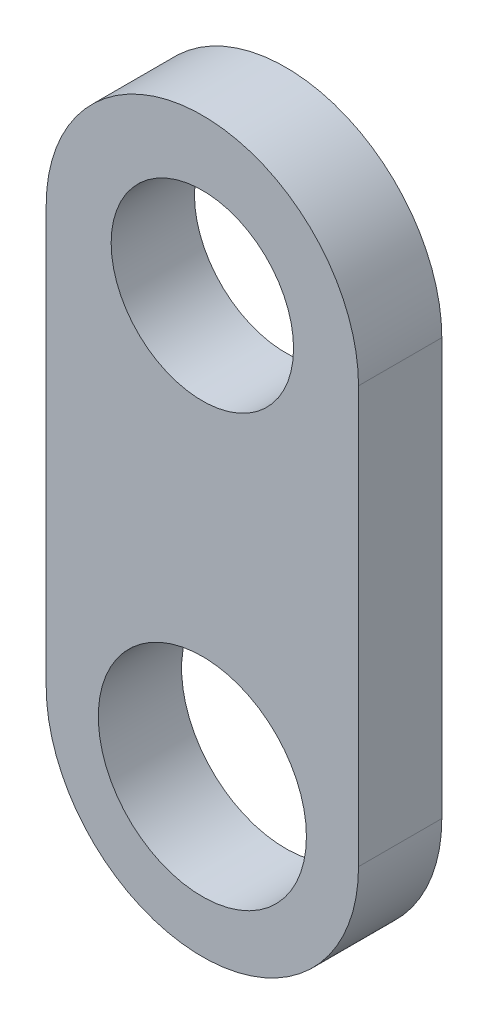
ISO-10303-21;
HEADER;
FILE_DESCRIPTION(('STEP AP214'),'2;1');
FILE_NAME('part.step','',(''),(''),'','','');
FILE_SCHEMA(('AUTOMOTIVE_DESIGN { 1 0 10303 214 1 1 1 1 }'));
ENDSEC;
DATA;
#1=APPLICATION_CONTEXT('core data for automotive mechanical design processes');
#2=APPLICATION_PROTOCOL_DEFINITION('international standard','automotive_design',2000,#1);
#3=PRODUCT_CONTEXT('',#1,'mechanical');
#4=PRODUCT('Part','Part','',(#3));
#5=PRODUCT_RELATED_PRODUCT_CATEGORY('part','',(#4));
#6=PRODUCT_DEFINITION_FORMATION('','',#4);
#7=PRODUCT_DEFINITION_CONTEXT('part definition',#1,'design');
#8=PRODUCT_DEFINITION('design','',#6,#7);
#9=PRODUCT_DEFINITION_SHAPE('','',#8);
#10=(LENGTH_UNIT() NAMED_UNIT(*) SI_UNIT(.MILLI.,.METRE.));
#11=(NAMED_UNIT(*) PLANE_ANGLE_UNIT() SI_UNIT($,.RADIAN.));
#12=(NAMED_UNIT(*) SI_UNIT($,.STERADIAN.) SOLID_ANGLE_UNIT());
#13=UNCERTAINTY_MEASURE_WITH_UNIT(LENGTH_MEASURE(1.E-05),#10,'distance_accuracy_value','');
#14=(GEOMETRIC_REPRESENTATION_CONTEXT(3) GLOBAL_UNCERTAINTY_ASSIGNED_CONTEXT((#13)) GLOBAL_UNIT_ASSIGNED_CONTEXT((#10,
#11,#12)) REPRESENTATION_CONTEXT('',''));
#15=CARTESIAN_POINT('',(0.,0.,0.));
#16=DIRECTION('',(0.,0.,1.));
#17=DIRECTION('',(1.,0.,0.));
#18=AXIS2_PLACEMENT_3D('',#15,#16,#17);
#19=CARTESIAN_POINT('',(0.,0.,5.08));
#20=DIRECTION('',(0.,0.,1.));
#21=DIRECTION('',(1.,0.,0.));
#22=AXIS2_PLACEMENT_3D('',#19,#20,#21);
#23=PLANE('',#22);
#24=CARTESIAN_POINT('',(0.,50.8,5.08));
#25=DIRECTION('',(0.,0.,1.));
#26=DIRECTION('',(1.,0.,0.));
#27=AXIS2_PLACEMENT_3D('',#24,#25,#26);
#28=CIRCLE('',#27,11.1252);
#29=CARTESIAN_POINT('',(11.1252,50.8,5.08));
#30=VERTEX_POINT('',#29);
#31=EDGE_CURVE('E116',#30,#30,#28,.T.);
#32=ORIENTED_EDGE('',*,*,#31,.F.);
#33=EDGE_LOOP('',(#32));
#34=FACE_BOUND('',#33,.T.);
#35=CARTESIAN_POINT('',(0.,0.,5.08));
#36=DIRECTION('',(0.,0.,1.));
#37=DIRECTION('',(1.,0.,0.));
#38=AXIS2_PLACEMENT_3D('',#35,#36,#37);
#39=CIRCLE('',#38,19.05);
#40=CARTESIAN_POINT('',(-19.05,0.,5.08));
#41=VERTEX_POINT('',#40);
#42=CARTESIAN_POINT('',(19.05,0.,5.08));
#43=VERTEX_POINT('',#42);
#44=EDGE_CURVE('E99',#41,#43,#39,.T.);
#45=ORIENTED_EDGE('',*,*,#44,.T.);
#46=DIRECTION('',(0.,1.,0.));
#47=VECTOR('',#46,1.);
#48=CARTESIAN_POINT('',(19.05,0.,5.08));
#49=LINE('',#48,#47);
#50=CARTESIAN_POINT('',(19.05,50.8,5.08));
#51=VERTEX_POINT('',#50);
#52=EDGE_CURVE('E94',#43,#51,#49,.T.);
#53=ORIENTED_EDGE('',*,*,#52,.T.);
#54=CARTESIAN_POINT('',(0.,50.8,5.08));
#55=DIRECTION('',(0.,0.,1.));
#56=DIRECTION('',(1.,0.,0.));
#57=AXIS2_PLACEMENT_3D('',#54,#55,#56);
#58=CIRCLE('',#57,19.05);
#59=CARTESIAN_POINT('',(-19.05,50.8,5.08));
#60=VERTEX_POINT('',#59);
#61=EDGE_CURVE('E97',#51,#60,#58,.T.);
#62=ORIENTED_EDGE('',*,*,#61,.T.);
#63=DIRECTION('',(0.,-1.,0.));
#64=VECTOR('',#63,1.);
#65=CARTESIAN_POINT('',(-19.05,0.,5.08));
#66=LINE('',#65,#64);
#67=EDGE_CURVE('E61',#60,#41,#66,.T.);
#68=ORIENTED_EDGE('',*,*,#67,.T.);
#69=EDGE_LOOP('',(#45,#53,#62,#68));
#70=FACE_BOUND('',#69,.T.);
#71=CARTESIAN_POINT('',(0.,0.,5.08));
#72=DIRECTION('',(0.,0.,1.));
#73=DIRECTION('',(1.,0.,0.));
#74=AXIS2_PLACEMENT_3D('',#71,#72,#73);
#75=CIRCLE('',#74,12.69365);
#76=CARTESIAN_POINT('',(12.69365,0.,5.08));
#77=VERTEX_POINT('',#76);
#78=EDGE_CURVE('E145',#77,#77,#75,.T.);
#79=ORIENTED_EDGE('',*,*,#78,.F.);
#80=EDGE_LOOP('',(#79));
#81=FACE_BOUND('',#80,.T.);
#82=ADVANCED_FACE('F50',(#34,#70,#81),#23,.T.);
#83=CARTESIAN_POINT('',(0.,0.,-5.08));
#84=DIRECTION('',(0.,0.,1.));
#85=DIRECTION('',(1.,0.,0.));
#86=AXIS2_PLACEMENT_3D('',#83,#84,#85);
#87=PLANE('',#86);
#88=CARTESIAN_POINT('',(0.,0.,-5.08));
#89=DIRECTION('',(0.,0.,1.));
#90=DIRECTION('',(1.,0.,0.));
#91=AXIS2_PLACEMENT_3D('',#88,#89,#90);
#92=CIRCLE('',#91,19.05);
#93=CARTESIAN_POINT('',(-19.05,0.,-5.08));
#94=VERTEX_POINT('',#93);
#95=CARTESIAN_POINT('',(19.05,0.,-5.08));
#96=VERTEX_POINT('',#95);
#97=EDGE_CURVE('E118',#94,#96,#92,.T.);
#98=ORIENTED_EDGE('',*,*,#97,.F.);
#99=DIRECTION('',(0.,-1.,0.));
#100=VECTOR('',#99,1.);
#101=CARTESIAN_POINT('',(-19.05,0.,-5.08));
#102=LINE('',#101,#100);
#103=CARTESIAN_POINT('',(-19.05,50.8,-5.08));
#104=VERTEX_POINT('',#103);
#105=EDGE_CURVE('E88',#104,#94,#102,.T.);
#106=ORIENTED_EDGE('',*,*,#105,.F.);
#107=CARTESIAN_POINT('',(0.,50.8,-5.08));
#108=DIRECTION('',(0.,0.,1.));
#109=DIRECTION('',(1.,0.,0.));
#110=AXIS2_PLACEMENT_3D('',#107,#108,#109);
#111=CIRCLE('',#110,19.05);
#112=CARTESIAN_POINT('',(19.05,50.8,-5.08));
#113=VERTEX_POINT('',#112);
#114=EDGE_CURVE('E85',#113,#104,#111,.T.);
#115=ORIENTED_EDGE('',*,*,#114,.F.);
#116=DIRECTION('',(0.,1.,0.));
#117=VECTOR('',#116,1.);
#118=CARTESIAN_POINT('',(19.05,0.,-5.08));
#119=LINE('',#118,#117);
#120=EDGE_CURVE('E101',#96,#113,#119,.T.);
#121=ORIENTED_EDGE('',*,*,#120,.F.);
#122=EDGE_LOOP('',(#98,#106,#115,#121));
#123=FACE_BOUND('',#122,.T.);
#124=CARTESIAN_POINT('',(0.,50.8,-5.08));
#125=DIRECTION('',(0.,0.,1.));
#126=DIRECTION('',(1.,0.,0.));
#127=AXIS2_PLACEMENT_3D('',#124,#125,#126);
#128=CIRCLE('',#127,11.1252);
#129=CARTESIAN_POINT('',(11.1252,50.8,-5.08));
#130=VERTEX_POINT('',#129);
#131=EDGE_CURVE('E138',#130,#130,#128,.T.);
#132=ORIENTED_EDGE('',*,*,#131,.T.);
#133=EDGE_LOOP('',(#132));
#134=FACE_BOUND('',#133,.T.);
#135=CARTESIAN_POINT('',(0.,0.,-5.08));
#136=DIRECTION('',(0.,0.,1.));
#137=DIRECTION('',(1.,0.,0.));
#138=AXIS2_PLACEMENT_3D('',#135,#136,#137);
#139=CIRCLE('',#138,12.69365);
#140=CARTESIAN_POINT('',(12.69365,0.,-5.08));
#141=VERTEX_POINT('',#140);
#142=EDGE_CURVE('E147',#141,#141,#139,.T.);
#143=ORIENTED_EDGE('',*,*,#142,.T.);
#144=EDGE_LOOP('',(#143));
#145=FACE_BOUND('',#144,.T.);
#146=ADVANCED_FACE('F133',(#123,#134,#145),#87,.F.);
#147=CARTESIAN_POINT('',(0.,0.,5.08));
#148=DIRECTION('',(0.,0.,-1.));
#149=DIRECTION('',(-1.,0.,0.));
#150=AXIS2_PLACEMENT_3D('',#147,#148,#149);
#151=CYLINDRICAL_SURFACE('',#150,19.05);
#152=ORIENTED_EDGE('',*,*,#97,.T.);
#153=DIRECTION('',(0.,0.,-1.));
#154=VECTOR('',#153,1.);
#155=CARTESIAN_POINT('',(19.05,0.,5.08));
#156=LINE('',#155,#154);
#157=EDGE_CURVE('E12',#43,#96,#156,.T.);
#158=ORIENTED_EDGE('',*,*,#157,.F.);
#159=ORIENTED_EDGE('',*,*,#44,.F.);
#160=DIRECTION('',(0.,0.,-1.));
#161=VECTOR('',#160,1.);
#162=CARTESIAN_POINT('',(-19.05,0.,5.08));
#163=LINE('',#162,#161);
#164=EDGE_CURVE('E112',#41,#94,#163,.T.);
#165=ORIENTED_EDGE('',*,*,#164,.T.);
#166=EDGE_LOOP('',(#152,#158,#159,#165));
#167=FACE_BOUND('',#166,.T.);
#168=ADVANCED_FACE('F47',(#167),#151,.T.);
#169=CARTESIAN_POINT('',(19.05,0.,5.08));
#170=DIRECTION('',(-1.,0.,0.));
#171=DIRECTION('',(0.,0.,1.));
#172=AXIS2_PLACEMENT_3D('',#169,#170,#171);
#173=PLANE('',#172);
#174=ORIENTED_EDGE('',*,*,#120,.T.);
#175=DIRECTION('',(0.,0.,-1.));
#176=VECTOR('',#175,1.);
#177=CARTESIAN_POINT('',(19.05,50.8,5.08));
#178=LINE('',#177,#176);
#179=EDGE_CURVE('E60',#51,#113,#178,.T.);
#180=ORIENTED_EDGE('',*,*,#179,.F.);
#181=ORIENTED_EDGE('',*,*,#52,.F.);
#182=ORIENTED_EDGE('',*,*,#157,.T.);
#183=EDGE_LOOP('',(#174,#180,#181,#182));
#184=FACE_BOUND('',#183,.T.);
#185=ADVANCED_FACE('F104',(#184),#173,.F.);
#186=CARTESIAN_POINT('',(0.,50.8,5.08));
#187=DIRECTION('',(0.,0.,-1.));
#188=DIRECTION('',(-1.,0.,0.));
#189=AXIS2_PLACEMENT_3D('',#186,#187,#188);
#190=CYLINDRICAL_SURFACE('',#189,19.05);
#191=ORIENTED_EDGE('',*,*,#114,.T.);
#192=DIRECTION('',(0.,0.,-1.));
#193=VECTOR('',#192,1.);
#194=CARTESIAN_POINT('',(-19.05,50.8,5.08));
#195=LINE('',#194,#193);
#196=EDGE_CURVE('E108',#60,#104,#195,.T.);
#197=ORIENTED_EDGE('',*,*,#196,.F.);
#198=ORIENTED_EDGE('',*,*,#61,.F.);
#199=ORIENTED_EDGE('',*,*,#179,.T.);
#200=EDGE_LOOP('',(#191,#197,#198,#199));
#201=FACE_BOUND('',#200,.T.);
#202=ADVANCED_FACE('F109',(#201),#190,.T.);
#203=CARTESIAN_POINT('',(-19.05,0.,5.08));
#204=DIRECTION('',(1.,0.,0.));
#205=DIRECTION('',(0.,0.,-1.));
#206=AXIS2_PLACEMENT_3D('',#203,#204,#205);
#207=PLANE('',#206);
#208=ORIENTED_EDGE('',*,*,#105,.T.);
#209=ORIENTED_EDGE('',*,*,#164,.F.);
#210=ORIENTED_EDGE('',*,*,#67,.F.);
#211=ORIENTED_EDGE('',*,*,#196,.T.);
#212=EDGE_LOOP('',(#208,#209,#210,#211));
#213=FACE_BOUND('',#212,.T.);
#214=ADVANCED_FACE('F127',(#213),#207,.F.);
#215=CARTESIAN_POINT('',(0.,50.8,5.08));
#216=DIRECTION('',(0.,0.,-1.));
#217=DIRECTION('',(-1.,0.,0.));
#218=AXIS2_PLACEMENT_3D('',#215,#216,#217);
#219=CYLINDRICAL_SURFACE('',#218,11.1252);
#220=ORIENTED_EDGE('',*,*,#31,.T.);
#221=EDGE_LOOP('',(#220));
#222=FACE_BOUND('',#221,.T.);
#223=ORIENTED_EDGE('',*,*,#131,.F.);
#224=EDGE_LOOP('',(#223));
#225=FACE_BOUND('',#224,.T.);
#226=ADVANCED_FACE('F161',(#222,#225),#219,.F.);
#227=CARTESIAN_POINT('',(0.,0.,5.08));
#228=DIRECTION('',(0.,0.,-1.));
#229=DIRECTION('',(-1.,0.,0.));
#230=AXIS2_PLACEMENT_3D('',#227,#228,#229);
#231=CYLINDRICAL_SURFACE('',#230,12.69365);
#232=ORIENTED_EDGE('',*,*,#78,.T.);
#233=EDGE_LOOP('',(#232));
#234=FACE_BOUND('',#233,.T.);
#235=ORIENTED_EDGE('',*,*,#142,.F.);
#236=EDGE_LOOP('',(#235));
#237=FACE_BOUND('',#236,.T.);
#238=ADVANCED_FACE('F155',(#234,#237),#231,.F.);
#239=CLOSED_SHELL('',(#82,#146,#168,#185,#202,#214,#226,#238));
#240=MANIFOLD_SOLID_BREP('B2',#239);
#241=ADVANCED_BREP_SHAPE_REPRESENTATION('',(#18,#240),#14);
#242=SHAPE_DEFINITION_REPRESENTATION(#9,#241);
ENDSEC;
END-ISO-10303-21;
